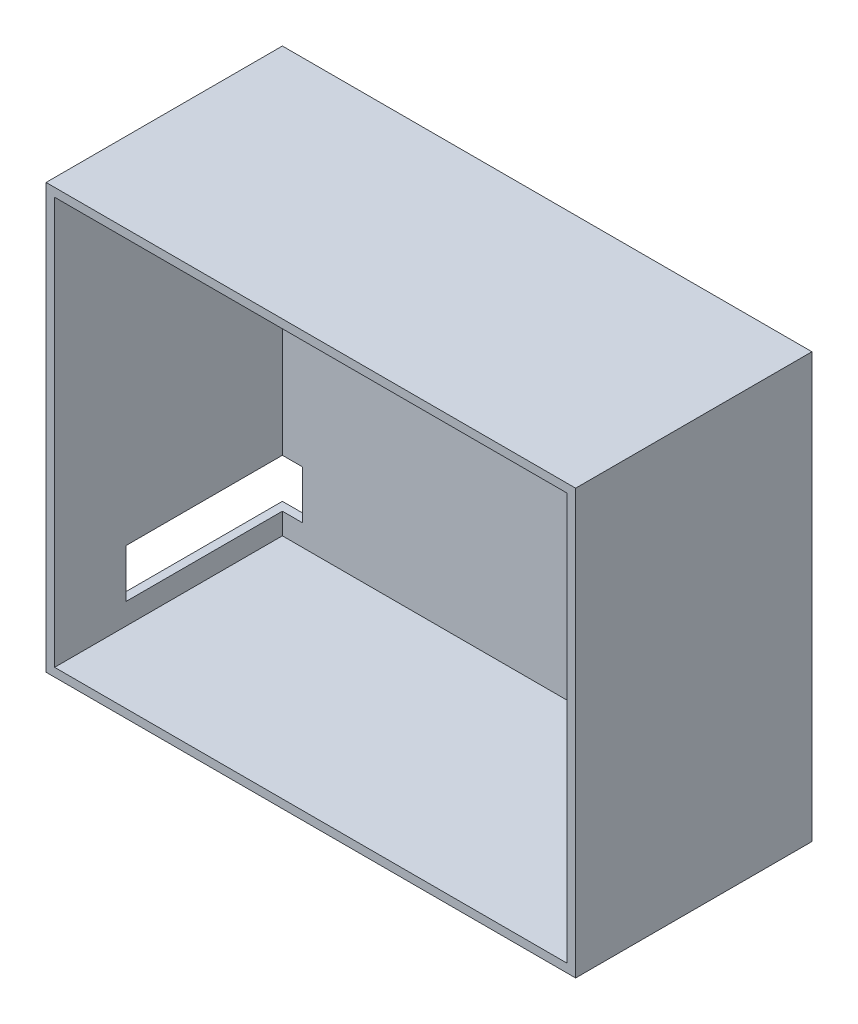
ISO-10303-21;
HEADER;
FILE_DESCRIPTION(('STEP AP214'),'2;1');
FILE_NAME('part.step','',(''),(''),'','','');
FILE_SCHEMA(('AUTOMOTIVE_DESIGN { 1 0 10303 214 1 1 1 1 }'));
ENDSEC;
DATA;
#1=APPLICATION_CONTEXT('core data for automotive mechanical design processes');
#2=APPLICATION_PROTOCOL_DEFINITION('international standard','automotive_design',2000,#1);
#3=PRODUCT_CONTEXT('',#1,'mechanical');
#4=PRODUCT('Part','Part','',(#3));
#5=PRODUCT_RELATED_PRODUCT_CATEGORY('part','',(#4));
#6=PRODUCT_DEFINITION_FORMATION('','',#4);
#7=PRODUCT_DEFINITION_CONTEXT('part definition',#1,'design');
#8=PRODUCT_DEFINITION('design','',#6,#7);
#9=PRODUCT_DEFINITION_SHAPE('','',#8);
#10=(LENGTH_UNIT() NAMED_UNIT(*) SI_UNIT(.MILLI.,.METRE.));
#11=(NAMED_UNIT(*) PLANE_ANGLE_UNIT() SI_UNIT($,.RADIAN.));
#12=(NAMED_UNIT(*) SI_UNIT($,.STERADIAN.) SOLID_ANGLE_UNIT());
#13=UNCERTAINTY_MEASURE_WITH_UNIT(LENGTH_MEASURE(1.E-05),#10,'distance_accuracy_value','');
#14=(GEOMETRIC_REPRESENTATION_CONTEXT(3) GLOBAL_UNCERTAINTY_ASSIGNED_CONTEXT((#13)) GLOBAL_UNIT_ASSIGNED_CONTEXT((#10,
#11,#12)) REPRESENTATION_CONTEXT('',''));
#15=CARTESIAN_POINT('',(0.,0.,0.));
#16=DIRECTION('',(0.,0.,1.));
#17=DIRECTION('',(1.,0.,0.));
#18=AXIS2_PLACEMENT_3D('',#15,#16,#17);
#19=CARTESIAN_POINT('',(0.,0.,0.));
#20=DIRECTION('',(0.,0.,-1.));
#21=DIRECTION('',(-1.,0.,0.));
#22=AXIS2_PLACEMENT_3D('',#19,#20,#21);
#23=PLANE('',#22);
#24=DIRECTION('',(1.,0.,0.));
#25=VECTOR('',#24,1.);
#26=CARTESIAN_POINT('',(-1.,10.5,0.));
#27=LINE('',#26,#25);
#28=CARTESIAN_POINT('',(0.,10.5,0.));
#29=VERTEX_POINT('',#28);
#30=CARTESIAN_POINT('',(10.,10.5,0.));
#31=VERTEX_POINT('',#30);
#32=EDGE_CURVE('E159',#29,#31,#27,.T.);
#33=ORIENTED_EDGE('',*,*,#32,.T.);
#34=DIRECTION('',(0.,1.,0.));
#35=VECTOR('',#34,1.);
#36=CARTESIAN_POINT('',(10.,19.5,0.));
#37=LINE('',#36,#35);
#38=CARTESIAN_POINT('',(10.,27.5,0.));
#39=VERTEX_POINT('',#38);
#40=EDGE_CURVE('E143',#31,#39,#37,.T.);
#41=ORIENTED_EDGE('',*,*,#40,.T.);
#42=DIRECTION('',(-1.,0.,0.));
#43=VECTOR('',#42,1.);
#44=CARTESIAN_POINT('',(-1.,27.5,0.));
#45=LINE('',#44,#43);
#46=CARTESIAN_POINT('',(0.,27.5,0.));
#47=VERTEX_POINT('',#46);
#48=EDGE_CURVE('E62',#39,#47,#45,.T.);
#49=ORIENTED_EDGE('',*,*,#48,.T.);
#50=DIRECTION('',(0.,-1.,0.));
#51=VECTOR('',#50,1.);
#52=CARTESIAN_POINT('',(0.,0.,0.));
#53=LINE('',#52,#51);
#54=CARTESIAN_POINT('',(0.,149.,0.));
#55=VERTEX_POINT('',#54);
#56=EDGE_CURVE('E259',#55,#47,#53,.T.);
#57=ORIENTED_EDGE('',*,*,#56,.F.);
#58=DIRECTION('',(-1.,0.,0.));
#59=VECTOR('',#58,1.);
#60=CARTESIAN_POINT('',(0.,149.,0.));
#61=LINE('',#60,#59);
#62=CARTESIAN_POINT('',(186.,149.,0.));
#63=VERTEX_POINT('',#62);
#64=EDGE_CURVE('E267',#63,#55,#61,.T.);
#65=ORIENTED_EDGE('',*,*,#64,.F.);
#66=DIRECTION('',(0.,1.,0.));
#67=VECTOR('',#66,1.);
#68=CARTESIAN_POINT('',(186.,0.,0.));
#69=LINE('',#68,#67);
#70=CARTESIAN_POINT('',(186.,0.,0.));
#71=VERTEX_POINT('',#70);
#72=EDGE_CURVE('E264',#71,#63,#69,.T.);
#73=ORIENTED_EDGE('',*,*,#72,.F.);
#74=DIRECTION('',(1.,0.,0.));
#75=VECTOR('',#74,1.);
#76=CARTESIAN_POINT('',(0.,0.,0.));
#77=LINE('',#76,#75);
#78=CARTESIAN_POINT('',(0.,0.,0.));
#79=VERTEX_POINT('',#78);
#80=EDGE_CURVE('E265',#79,#71,#77,.T.);
#81=ORIENTED_EDGE('',*,*,#80,.F.);
#82=EDGE_CURVE('E168',#29,#79,#53,.T.);
#83=ORIENTED_EDGE('',*,*,#82,.F.);
#84=EDGE_LOOP('',(#33,#41,#49,#57,#65,#73,#81,#83));
#85=FACE_BOUND('',#84,.T.);
#86=ADVANCED_FACE('F44',(#85),#23,.T.);
#87=CARTESIAN_POINT('',(0.,0.,3.));
#88=DIRECTION('',(1.,0.,0.));
#89=DIRECTION('',(0.,0.,-1.));
#90=AXIS2_PLACEMENT_3D('',#87,#88,#89);
#91=PLANE('',#90);
#92=DIRECTION('',(0.,0.,1.));
#93=VECTOR('',#92,1.);
#94=CARTESIAN_POINT('',(0.,10.5,3.));
#95=LINE('',#94,#93);
#96=CARTESIAN_POINT('',(0.,10.5,58.));
#97=VERTEX_POINT('',#96);
#98=EDGE_CURVE('E155',#29,#97,#95,.T.);
#99=ORIENTED_EDGE('',*,*,#98,.F.);
#100=ORIENTED_EDGE('',*,*,#82,.T.);
#101=DIRECTION('',(0.,0.,-1.));
#102=VECTOR('',#101,1.);
#103=CARTESIAN_POINT('',(0.,0.,3.));
#104=LINE('',#103,#102);
#105=CARTESIAN_POINT('',(0.,0.,83.));
#106=VERTEX_POINT('',#105);
#107=EDGE_CURVE('E283',#106,#79,#104,.T.);
#108=ORIENTED_EDGE('',*,*,#107,.F.);
#109=DIRECTION('',(0.,-1.,0.));
#110=VECTOR('',#109,1.);
#111=CARTESIAN_POINT('',(0.,0.,83.));
#112=LINE('',#111,#110);
#113=CARTESIAN_POINT('',(0.,149.,83.));
#114=VERTEX_POINT('',#113);
#115=EDGE_CURVE('E221',#114,#106,#112,.T.);
#116=ORIENTED_EDGE('',*,*,#115,.F.);
#117=DIRECTION('',(0.,0.,-1.));
#118=VECTOR('',#117,1.);
#119=CARTESIAN_POINT('',(0.,149.,3.));
#120=LINE('',#119,#118);
#121=EDGE_CURVE('E272',#114,#55,#120,.T.);
#122=ORIENTED_EDGE('',*,*,#121,.T.);
#123=ORIENTED_EDGE('',*,*,#56,.T.);
#124=DIRECTION('',(0.,0.,-1.));
#125=VECTOR('',#124,1.);
#126=CARTESIAN_POINT('',(0.,27.5,3.));
#127=LINE('',#126,#125);
#128=CARTESIAN_POINT('',(0.,27.5,58.));
#129=VERTEX_POINT('',#128);
#130=EDGE_CURVE('E192',#129,#47,#127,.T.);
#131=ORIENTED_EDGE('',*,*,#130,.F.);
#132=DIRECTION('',(0.,1.,0.));
#133=VECTOR('',#132,1.);
#134=CARTESIAN_POINT('',(0.,0.,58.));
#135=LINE('',#134,#133);
#136=EDGE_CURVE('E191',#97,#129,#135,.T.);
#137=ORIENTED_EDGE('',*,*,#136,.F.);
#138=EDGE_LOOP('',(#99,#100,#108,#116,#122,#123,#131,#137));
#139=FACE_BOUND('',#138,.T.);
#140=ADVANCED_FACE('F50',(#139),#91,.F.);
#141=CARTESIAN_POINT('',(3.,3.,83.));
#142=DIRECTION('',(1.,0.,0.));
#143=DIRECTION('',(0.,0.,-1.));
#144=AXIS2_PLACEMENT_3D('',#141,#142,#143);
#145=PLANE('',#144);
#146=DIRECTION('',(0.,-1.,0.));
#147=VECTOR('',#146,1.);
#148=CARTESIAN_POINT('',(3.,0.,3.));
#149=LINE('',#148,#147);
#150=CARTESIAN_POINT('',(3.,10.5,3.));
#151=VERTEX_POINT('',#150);
#152=CARTESIAN_POINT('',(3.,3.,3.));
#153=VERTEX_POINT('',#152);
#154=EDGE_CURVE('E254',#151,#153,#149,.T.);
#155=ORIENTED_EDGE('',*,*,#154,.F.);
#156=DIRECTION('',(0.,0.,1.));
#157=VECTOR('',#156,1.);
#158=CARTESIAN_POINT('',(3.,10.5,83.));
#159=LINE('',#158,#157);
#160=CARTESIAN_POINT('',(3.,10.5,58.));
#161=VERTEX_POINT('',#160);
#162=EDGE_CURVE('E163',#151,#161,#159,.T.);
#163=ORIENTED_EDGE('',*,*,#162,.T.);
#164=DIRECTION('',(0.,1.,0.));
#165=VECTOR('',#164,1.);
#166=CARTESIAN_POINT('',(3.,3.,58.));
#167=LINE('',#166,#165);
#168=CARTESIAN_POINT('',(3.,27.5,58.));
#169=VERTEX_POINT('',#168);
#170=EDGE_CURVE('E53',#161,#169,#167,.T.);
#171=ORIENTED_EDGE('',*,*,#170,.T.);
#172=DIRECTION('',(0.,0.,-1.));
#173=VECTOR('',#172,1.);
#174=CARTESIAN_POINT('',(3.,27.5,83.));
#175=LINE('',#174,#173);
#176=CARTESIAN_POINT('',(3.,27.5,3.));
#177=VERTEX_POINT('',#176);
#178=EDGE_CURVE('E190',#169,#177,#175,.T.);
#179=ORIENTED_EDGE('',*,*,#178,.T.);
#180=CARTESIAN_POINT('',(3.,146.,3.));
#181=VERTEX_POINT('',#180);
#182=EDGE_CURVE('E251',#181,#177,#149,.T.);
#183=ORIENTED_EDGE('',*,*,#182,.F.);
#184=DIRECTION('',(0.,0.,-1.));
#185=VECTOR('',#184,1.);
#186=CARTESIAN_POINT('',(3.,146.,83.));
#187=LINE('',#186,#185);
#188=CARTESIAN_POINT('',(3.,146.,83.));
#189=VERTEX_POINT('',#188);
#190=EDGE_CURVE('E208',#189,#181,#187,.T.);
#191=ORIENTED_EDGE('',*,*,#190,.F.);
#192=DIRECTION('',(0.,-1.,0.));
#193=VECTOR('',#192,1.);
#194=CARTESIAN_POINT('',(3.,3.,83.));
#195=LINE('',#194,#193);
#196=CARTESIAN_POINT('',(3.,3.,83.));
#197=VERTEX_POINT('',#196);
#198=EDGE_CURVE('E200',#189,#197,#195,.T.);
#199=ORIENTED_EDGE('',*,*,#198,.T.);
#200=DIRECTION('',(0.,0.,-1.));
#201=VECTOR('',#200,1.);
#202=CARTESIAN_POINT('',(3.,3.,83.));
#203=LINE('',#202,#201);
#204=EDGE_CURVE('E223',#197,#153,#203,.T.);
#205=ORIENTED_EDGE('',*,*,#204,.T.);
#206=EDGE_LOOP('',(#155,#163,#171,#179,#183,#191,#199,#205));
#207=FACE_BOUND('',#206,.T.);
#208=ADVANCED_FACE('F298',(#207),#145,.T.);
#209=CARTESIAN_POINT('',(0.,0.,3.));
#210=DIRECTION('',(0.,0.,-1.));
#211=DIRECTION('',(-1.,0.,0.));
#212=AXIS2_PLACEMENT_3D('',#209,#210,#211);
#213=PLANE('',#212);
#214=DIRECTION('',(1.,0.,0.));
#215=VECTOR('',#214,1.);
#216=CARTESIAN_POINT('',(0.,10.5,3.));
#217=LINE('',#216,#215);
#218=CARTESIAN_POINT('',(10.,10.5,3.00000000000002));
#219=VERTEX_POINT('',#218);
#220=EDGE_CURVE('E11',#151,#219,#217,.T.);
#221=ORIENTED_EDGE('',*,*,#220,.F.);
#222=ORIENTED_EDGE('',*,*,#154,.T.);
#223=DIRECTION('',(1.,0.,0.));
#224=VECTOR('',#223,1.);
#225=CARTESIAN_POINT('',(0.,3.,3.));
#226=LINE('',#225,#224);
#227=CARTESIAN_POINT('',(183.,3.,3.));
#228=VERTEX_POINT('',#227);
#229=EDGE_CURVE('E248',#153,#228,#226,.T.);
#230=ORIENTED_EDGE('',*,*,#229,.T.);
#231=DIRECTION('',(0.,1.,0.));
#232=VECTOR('',#231,1.);
#233=CARTESIAN_POINT('',(183.,0.,3.));
#234=LINE('',#233,#232);
#235=CARTESIAN_POINT('',(183.,146.,3.));
#236=VERTEX_POINT('',#235);
#237=EDGE_CURVE('E244',#228,#236,#234,.T.);
#238=ORIENTED_EDGE('',*,*,#237,.T.);
#239=DIRECTION('',(-1.,0.,0.));
#240=VECTOR('',#239,1.);
#241=CARTESIAN_POINT('',(0.,146.,3.));
#242=LINE('',#241,#240);
#243=EDGE_CURVE('E241',#236,#181,#242,.T.);
#244=ORIENTED_EDGE('',*,*,#243,.T.);
#245=ORIENTED_EDGE('',*,*,#182,.T.);
#246=DIRECTION('',(-1.,0.,0.));
#247=VECTOR('',#246,1.);
#248=CARTESIAN_POINT('',(0.,27.5,3.));
#249=LINE('',#248,#247);
#250=CARTESIAN_POINT('',(10.,27.5,3.));
#251=VERTEX_POINT('',#250);
#252=EDGE_CURVE('E289',#251,#177,#249,.T.);
#253=ORIENTED_EDGE('',*,*,#252,.F.);
#254=DIRECTION('',(0.,1.,0.));
#255=VECTOR('',#254,1.);
#256=CARTESIAN_POINT('',(10.,0.,3.));
#257=LINE('',#256,#255);
#258=EDGE_CURVE('E286',#219,#251,#257,.T.);
#259=ORIENTED_EDGE('',*,*,#258,.F.);
#260=EDGE_LOOP('',(#221,#222,#230,#238,#244,#245,#253,#259));
#261=FACE_BOUND('',#260,.T.);
#262=ADVANCED_FACE('F310',(#261),#213,.F.);
#263=CARTESIAN_POINT('',(0.,0.,3.));
#264=DIRECTION('',(0.,1.,0.));
#265=DIRECTION('',(0.,0.,1.));
#266=AXIS2_PLACEMENT_3D('',#263,#264,#265);
#267=PLANE('',#266);
#268=ORIENTED_EDGE('',*,*,#80,.T.);
#269=DIRECTION('',(0.,0.,-1.));
#270=VECTOR('',#269,1.);
#271=CARTESIAN_POINT('',(186.,0.,3.));
#272=LINE('',#271,#270);
#273=CARTESIAN_POINT('',(186.,0.,83.));
#274=VERTEX_POINT('',#273);
#275=EDGE_CURVE('E276',#274,#71,#272,.T.);
#276=ORIENTED_EDGE('',*,*,#275,.F.);
#277=DIRECTION('',(1.,0.,0.));
#278=VECTOR('',#277,1.);
#279=CARTESIAN_POINT('',(0.,0.,83.));
#280=LINE('',#279,#278);
#281=EDGE_CURVE('E230',#106,#274,#280,.T.);
#282=ORIENTED_EDGE('',*,*,#281,.F.);
#283=ORIENTED_EDGE('',*,*,#107,.T.);
#284=EDGE_LOOP('',(#268,#276,#282,#283));
#285=FACE_BOUND('',#284,.T.);
#286=ADVANCED_FACE('F346',(#285),#267,.F.);
#287=CARTESIAN_POINT('',(186.,0.,3.));
#288=DIRECTION('',(-1.,0.,0.));
#289=DIRECTION('',(0.,0.,1.));
#290=AXIS2_PLACEMENT_3D('',#287,#288,#289);
#291=PLANE('',#290);
#292=ORIENTED_EDGE('',*,*,#72,.T.);
#293=DIRECTION('',(0.,0.,-1.));
#294=VECTOR('',#293,1.);
#295=CARTESIAN_POINT('',(186.,149.,3.));
#296=LINE('',#295,#294);
#297=CARTESIAN_POINT('',(186.,149.,83.));
#298=VERTEX_POINT('',#297);
#299=EDGE_CURVE('E273',#298,#63,#296,.T.);
#300=ORIENTED_EDGE('',*,*,#299,.F.);
#301=DIRECTION('',(0.,1.,0.));
#302=VECTOR('',#301,1.);
#303=CARTESIAN_POINT('',(186.,0.,83.));
#304=LINE('',#303,#302);
#305=EDGE_CURVE('E231',#274,#298,#304,.T.);
#306=ORIENTED_EDGE('',*,*,#305,.F.);
#307=ORIENTED_EDGE('',*,*,#275,.T.);
#308=EDGE_LOOP('',(#292,#300,#306,#307));
#309=FACE_BOUND('',#308,.T.);
#310=ADVANCED_FACE('F344',(#309),#291,.F.);
#311=CARTESIAN_POINT('',(0.,149.,3.));
#312=DIRECTION('',(0.,-1.,0.));
#313=DIRECTION('',(0.,0.,-1.));
#314=AXIS2_PLACEMENT_3D('',#311,#312,#313);
#315=PLANE('',#314);
#316=ORIENTED_EDGE('',*,*,#64,.T.);
#317=ORIENTED_EDGE('',*,*,#121,.F.);
#318=DIRECTION('',(-1.,0.,0.));
#319=VECTOR('',#318,1.);
#320=CARTESIAN_POINT('',(0.,149.,83.));
#321=LINE('',#320,#319);
#322=EDGE_CURVE('E240',#298,#114,#321,.T.);
#323=ORIENTED_EDGE('',*,*,#322,.F.);
#324=ORIENTED_EDGE('',*,*,#299,.T.);
#325=EDGE_LOOP('',(#316,#317,#323,#324));
#326=FACE_BOUND('',#325,.T.);
#327=ADVANCED_FACE('F338',(#326),#315,.F.);
#328=CARTESIAN_POINT('',(3.,3.,83.));
#329=DIRECTION('',(0.,1.,0.));
#330=DIRECTION('',(0.,0.,1.));
#331=AXIS2_PLACEMENT_3D('',#328,#329,#330);
#332=PLANE('',#331);
#333=ORIENTED_EDGE('',*,*,#229,.F.);
#334=ORIENTED_EDGE('',*,*,#204,.F.);
#335=DIRECTION('',(1.,0.,0.));
#336=VECTOR('',#335,1.);
#337=CARTESIAN_POINT('',(3.,3.,83.));
#338=LINE('',#337,#336);
#339=CARTESIAN_POINT('',(183.,3.,83.));
#340=VERTEX_POINT('',#339);
#341=EDGE_CURVE('E199',#197,#340,#338,.T.);
#342=ORIENTED_EDGE('',*,*,#341,.T.);
#343=DIRECTION('',(0.,0.,-1.));
#344=VECTOR('',#343,1.);
#345=CARTESIAN_POINT('',(183.,3.,83.));
#346=LINE('',#345,#344);
#347=EDGE_CURVE('E220',#340,#228,#346,.T.);
#348=ORIENTED_EDGE('',*,*,#347,.T.);
#349=EDGE_LOOP('',(#333,#334,#342,#348));
#350=FACE_BOUND('',#349,.T.);
#351=ADVANCED_FACE('F318',(#350),#332,.T.);
#352=CARTESIAN_POINT('',(183.,3.,83.));
#353=DIRECTION('',(-1.,0.,0.));
#354=DIRECTION('',(0.,0.,1.));
#355=AXIS2_PLACEMENT_3D('',#352,#353,#354);
#356=PLANE('',#355);
#357=ORIENTED_EDGE('',*,*,#237,.F.);
#358=ORIENTED_EDGE('',*,*,#347,.F.);
#359=DIRECTION('',(0.,1.,0.));
#360=VECTOR('',#359,1.);
#361=CARTESIAN_POINT('',(183.,3.,83.));
#362=LINE('',#361,#360);
#363=CARTESIAN_POINT('',(183.,146.,83.));
#364=VERTEX_POINT('',#363);
#365=EDGE_CURVE('E202',#340,#364,#362,.T.);
#366=ORIENTED_EDGE('',*,*,#365,.T.);
#367=DIRECTION('',(0.,0.,-1.));
#368=VECTOR('',#367,1.);
#369=CARTESIAN_POINT('',(183.,146.,83.));
#370=LINE('',#369,#368);
#371=EDGE_CURVE('E214',#364,#236,#370,.T.);
#372=ORIENTED_EDGE('',*,*,#371,.T.);
#373=EDGE_LOOP('',(#357,#358,#366,#372));
#374=FACE_BOUND('',#373,.T.);
#375=ADVANCED_FACE('F325',(#374),#356,.T.);
#376=CARTESIAN_POINT('',(3.,146.,83.));
#377=DIRECTION('',(0.,-1.,0.));
#378=DIRECTION('',(0.,0.,-1.));
#379=AXIS2_PLACEMENT_3D('',#376,#377,#378);
#380=PLANE('',#379);
#381=ORIENTED_EDGE('',*,*,#243,.F.);
#382=ORIENTED_EDGE('',*,*,#371,.F.);
#383=DIRECTION('',(-1.,0.,0.));
#384=VECTOR('',#383,1.);
#385=CARTESIAN_POINT('',(3.,146.,83.));
#386=LINE('',#385,#384);
#387=EDGE_CURVE('E210',#364,#189,#386,.T.);
#388=ORIENTED_EDGE('',*,*,#387,.T.);
#389=ORIENTED_EDGE('',*,*,#190,.T.);
#390=EDGE_LOOP('',(#381,#382,#388,#389));
#391=FACE_BOUND('',#390,.T.);
#392=ADVANCED_FACE('F321',(#391),#380,.T.);
#393=CARTESIAN_POINT('',(0.,0.,83.));
#394=DIRECTION('',(0.,0.,-1.));
#395=DIRECTION('',(-1.,0.,0.));
#396=AXIS2_PLACEMENT_3D('',#393,#394,#395);
#397=PLANE('',#396);
#398=ORIENTED_EDGE('',*,*,#115,.T.);
#399=ORIENTED_EDGE('',*,*,#281,.T.);
#400=ORIENTED_EDGE('',*,*,#305,.T.);
#401=ORIENTED_EDGE('',*,*,#322,.T.);
#402=EDGE_LOOP('',(#398,#399,#400,#401));
#403=FACE_BOUND('',#402,.T.);
#404=ORIENTED_EDGE('',*,*,#198,.F.);
#405=ORIENTED_EDGE('',*,*,#387,.F.);
#406=ORIENTED_EDGE('',*,*,#365,.F.);
#407=ORIENTED_EDGE('',*,*,#341,.F.);
#408=EDGE_LOOP('',(#404,#405,#406,#407));
#409=FACE_BOUND('',#408,.T.);
#410=ADVANCED_FACE('F314',(#403,#409),#397,.F.);
#411=CARTESIAN_POINT('',(0.,0.,58.));
#412=DIRECTION('',(0.,0.,-1.));
#413=DIRECTION('',(-1.,0.,0.));
#414=AXIS2_PLACEMENT_3D('',#411,#412,#413);
#415=PLANE('',#414);
#416=ORIENTED_EDGE('',*,*,#136,.T.);
#417=DIRECTION('',(-1.,0.,0.));
#418=VECTOR('',#417,1.);
#419=CARTESIAN_POINT('',(-1.,27.5,58.));
#420=LINE('',#419,#418);
#421=EDGE_CURVE('E179',#169,#129,#420,.T.);
#422=ORIENTED_EDGE('',*,*,#421,.F.);
#423=ORIENTED_EDGE('',*,*,#170,.F.);
#424=DIRECTION('',(1.,0.,0.));
#425=VECTOR('',#424,1.);
#426=CARTESIAN_POINT('',(-1.,10.5,58.));
#427=LINE('',#426,#425);
#428=EDGE_CURVE('E162',#97,#161,#427,.T.);
#429=ORIENTED_EDGE('',*,*,#428,.F.);
#430=EDGE_LOOP('',(#416,#422,#423,#429));
#431=FACE_BOUND('',#430,.T.);
#432=ADVANCED_FACE('F301',(#431),#415,.T.);
#433=CARTESIAN_POINT('',(10.,19.5,58.));
#434=DIRECTION('',(-1.,0.,0.));
#435=DIRECTION('',(0.,0.,1.));
#436=AXIS2_PLACEMENT_3D('',#433,#434,#435);
#437=PLANE('',#436);
#438=ORIENTED_EDGE('',*,*,#258,.T.);
#439=DIRECTION('',(0.,0.,-1.));
#440=VECTOR('',#439,1.);
#441=CARTESIAN_POINT('',(10.,27.5,58.));
#442=LINE('',#441,#440);
#443=EDGE_CURVE('E63',#251,#39,#442,.T.);
#444=ORIENTED_EDGE('',*,*,#443,.T.);
#445=ORIENTED_EDGE('',*,*,#40,.F.);
#446=DIRECTION('',(0.,0.,-1.));
#447=VECTOR('',#446,1.);
#448=CARTESIAN_POINT('',(10.,10.5,58.));
#449=LINE('',#448,#447);
#450=EDGE_CURVE('E149',#219,#31,#449,.T.);
#451=ORIENTED_EDGE('',*,*,#450,.F.);
#452=EDGE_LOOP('',(#438,#444,#445,#451));
#453=FACE_BOUND('',#452,.T.);
#454=ADVANCED_FACE('F150',(#453),#437,.T.);
#455=CARTESIAN_POINT('',(-1.,27.5,58.));
#456=DIRECTION('',(0.,-1.,0.));
#457=DIRECTION('',(0.,0.,-1.));
#458=AXIS2_PLACEMENT_3D('',#455,#456,#457);
#459=PLANE('',#458);
#460=ORIENTED_EDGE('',*,*,#130,.T.);
#461=ORIENTED_EDGE('',*,*,#48,.F.);
#462=ORIENTED_EDGE('',*,*,#443,.F.);
#463=ORIENTED_EDGE('',*,*,#252,.T.);
#464=ORIENTED_EDGE('',*,*,#178,.F.);
#465=ORIENTED_EDGE('',*,*,#421,.T.);
#466=EDGE_LOOP('',(#460,#461,#462,#463,#464,#465));
#467=FACE_BOUND('',#466,.T.);
#468=ADVANCED_FACE('F302',(#467),#459,.T.);
#469=CARTESIAN_POINT('',(-1.,10.5,58.));
#470=DIRECTION('',(0.,1.,0.));
#471=DIRECTION('',(0.,0.,1.));
#472=AXIS2_PLACEMENT_3D('',#469,#470,#471);
#473=PLANE('',#472);
#474=ORIENTED_EDGE('',*,*,#98,.T.);
#475=ORIENTED_EDGE('',*,*,#428,.T.);
#476=ORIENTED_EDGE('',*,*,#162,.F.);
#477=ORIENTED_EDGE('',*,*,#220,.T.);
#478=ORIENTED_EDGE('',*,*,#450,.T.);
#479=ORIENTED_EDGE('',*,*,#32,.F.);
#480=EDGE_LOOP('',(#474,#475,#476,#477,#478,#479));
#481=FACE_BOUND('',#480,.T.);
#482=ADVANCED_FACE('F158',(#481),#473,.T.);
#483=CLOSED_SHELL('',(#86,#140,#208,#262,#286,#310,#327,#351,#375,#392,#410,#432,#454,#468,#482));
#484=MANIFOLD_SOLID_BREP('B2',#483);
#485=ADVANCED_BREP_SHAPE_REPRESENTATION('',(#18,#484),#14);
#486=SHAPE_DEFINITION_REPRESENTATION(#9,#485);
ENDSEC;
END-ISO-10303-21;
